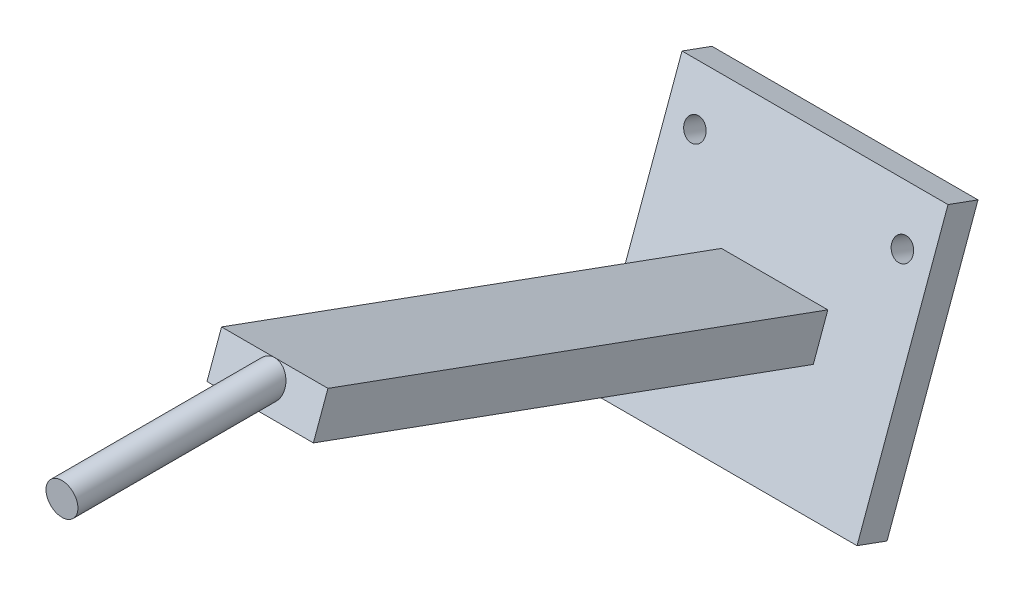
ISO-10303-21;
HEADER;
FILE_DESCRIPTION(('STEP AP214'),'2;1');
FILE_NAME('part.step','',(''),(''),'','','');
FILE_SCHEMA(('AUTOMOTIVE_DESIGN { 1 0 10303 214 1 1 1 1 }'));
ENDSEC;
DATA;
#1=APPLICATION_CONTEXT('core data for automotive mechanical design processes');
#2=APPLICATION_PROTOCOL_DEFINITION('international standard','automotive_design',2000,#1);
#3=PRODUCT_CONTEXT('',#1,'mechanical');
#4=PRODUCT('Part','Part','',(#3));
#5=PRODUCT_RELATED_PRODUCT_CATEGORY('part','',(#4));
#6=PRODUCT_DEFINITION_FORMATION('','',#4);
#7=PRODUCT_DEFINITION_CONTEXT('part definition',#1,'design');
#8=PRODUCT_DEFINITION('design','',#6,#7);
#9=PRODUCT_DEFINITION_SHAPE('','',#8);
#10=(LENGTH_UNIT() NAMED_UNIT(*) SI_UNIT(.MILLI.,.METRE.));
#11=(NAMED_UNIT(*) PLANE_ANGLE_UNIT() SI_UNIT($,.RADIAN.));
#12=(NAMED_UNIT(*) SI_UNIT($,.STERADIAN.) SOLID_ANGLE_UNIT());
#13=UNCERTAINTY_MEASURE_WITH_UNIT(LENGTH_MEASURE(1.E-05),#10,'distance_accuracy_value','');
#14=(GEOMETRIC_REPRESENTATION_CONTEXT(3) GLOBAL_UNCERTAINTY_ASSIGNED_CONTEXT((#13)) GLOBAL_UNIT_ASSIGNED_CONTEXT((#10,
#11,#12)) REPRESENTATION_CONTEXT('',''));
#15=CARTESIAN_POINT('',(0.,0.,0.));
#16=DIRECTION('',(0.,0.,1.));
#17=DIRECTION('',(1.,0.,0.));
#18=AXIS2_PLACEMENT_3D('',#15,#16,#17);
#19=CARTESIAN_POINT('',(-5.,1.5,0.));
#20=DIRECTION('',(0.,0.342020143325663,0.93969262078591));
#21=DIRECTION('',(0.,-0.939692620785911,0.342020143325663));
#22=AXIS2_PLACEMENT_3D('',#19,#20,#21);
#23=PLANE('',#22);
#24=DIRECTION('',(1.,0.,0.));
#25=VECTOR('',#24,1.);
#26=CARTESIAN_POINT('',(-5.,1.5,0.));
#27=LINE('',#26,#25);
#28=CARTESIAN_POINT('',(0.,1.5,0.));
#29=VERTEX_POINT('',#28);
#30=CARTESIAN_POINT('',(5.,1.5,0.));
#31=VERTEX_POINT('',#30);
#32=EDGE_CURVE('E172',#29,#31,#27,.T.);
#33=ORIENTED_EDGE('',*,*,#32,.F.);
#34=CARTESIAN_POINT('',(0.,0.,0.545955351399292));
#35=DIRECTION('',(0.,0.342020143325663,0.93969262078591));
#36=DIRECTION('',(0.,0.939692620785911,-0.342020143325663));
#37=AXIS2_PLACEMENT_3D('',#34,#35,#36);
#38=ELLIPSE('',#37,1.59626665871386,1.5);
#39=EDGE_CURVE('E48',#29,#29,#38,.T.);
#40=ORIENTED_EDGE('',*,*,#39,.F.);
#41=CARTESIAN_POINT('',(-5.,1.5,0.));
#42=VERTEX_POINT('',#41);
#43=EDGE_CURVE('E55',#42,#29,#27,.T.);
#44=ORIENTED_EDGE('',*,*,#43,.F.);
#45=DIRECTION('',(0.,-0.939692620785911,0.342020143325663));
#46=VECTOR('',#45,1.);
#47=CARTESIAN_POINT('',(-5.,1.5,0.));
#48=LINE('',#47,#46);
#49=CARTESIAN_POINT('',(-5.,-2.25877048314364,1.36808057330265));
#50=VERTEX_POINT('',#49);
#51=EDGE_CURVE('E162',#42,#50,#48,.T.);
#52=ORIENTED_EDGE('',*,*,#51,.T.);
#53=DIRECTION('',(1.,0.,0.));
#54=VECTOR('',#53,1.);
#55=CARTESIAN_POINT('',(-5.,-2.25877048314364,1.36808057330265));
#56=LINE('',#55,#54);
#57=CARTESIAN_POINT('',(5.,-2.25877048314364,1.36808057330265));
#58=VERTEX_POINT('',#57);
#59=EDGE_CURVE('E63',#50,#58,#56,.T.);
#60=ORIENTED_EDGE('',*,*,#59,.T.);
#61=DIRECTION('',(0.,-0.939692620785911,0.342020143325663));
#62=VECTOR('',#61,1.);
#63=CARTESIAN_POINT('',(5.,1.5,0.));
#64=LINE('',#63,#62);
#65=EDGE_CURVE('E142',#31,#58,#64,.T.);
#66=ORIENTED_EDGE('',*,*,#65,.F.);
#67=EDGE_LOOP('',(#33,#40,#44,#52,#60,#66));
#68=FACE_BOUND('',#67,.T.);
#69=ADVANCED_FACE('F39',(#68),#23,.T.);
#70=CARTESIAN_POINT('',(-5.,-15.6010071662831,-46.9846310392955));
#71=DIRECTION('',(0.,0.93969262078591,-0.342020143325663));
#72=DIRECTION('',(0.,0.342020143325663,0.939692620785911));
#73=AXIS2_PLACEMENT_3D('',#70,#71,#72);
#74=PLANE('',#73);
#75=ORIENTED_EDGE('',*,*,#43,.T.);
#76=ORIENTED_EDGE('',*,*,#32,.T.);
#77=DIRECTION('',(0.,0.342020143325663,0.939692620785911));
#78=VECTOR('',#77,1.);
#79=CARTESIAN_POINT('',(5.,-15.6010071662831,-46.9846310392955));
#80=LINE('',#79,#78);
#81=CARTESIAN_POINT('',(5.,-15.6010071662831,-46.9846310392955));
#82=VERTEX_POINT('',#81);
#83=EDGE_CURVE('E137',#82,#31,#80,.T.);
#84=ORIENTED_EDGE('',*,*,#83,.F.);
#85=DIRECTION('',(1.,0.,0.));
#86=VECTOR('',#85,1.);
#87=CARTESIAN_POINT('',(-5.,-15.6010071662831,-46.9846310392955));
#88=LINE('',#87,#86);
#89=CARTESIAN_POINT('',(-5.,-15.6010071662831,-46.9846310392955));
#90=VERTEX_POINT('',#89);
#91=EDGE_CURVE('E173',#90,#82,#88,.T.);
#92=ORIENTED_EDGE('',*,*,#91,.F.);
#93=DIRECTION('',(0.,0.342020143325663,0.939692620785911));
#94=VECTOR('',#93,1.);
#95=CARTESIAN_POINT('',(-5.,-15.6010071662831,-46.9846310392955));
#96=LINE('',#95,#94);
#97=EDGE_CURVE('E159',#90,#42,#96,.T.);
#98=ORIENTED_EDGE('',*,*,#97,.T.);
#99=EDGE_LOOP('',(#75,#76,#84,#92,#98));
#100=FACE_BOUND('',#99,.T.);
#101=ADVANCED_FACE('F193',(#100),#74,.T.);
#102=CARTESIAN_POINT('',(-5.,-2.25877048314364,1.36808057330265));
#103=DIRECTION('',(0.,-0.939692620785911,0.342020143325663));
#104=DIRECTION('',(0.,-0.342020143325663,-0.939692620785911));
#105=AXIS2_PLACEMENT_3D('',#102,#103,#104);
#106=PLANE('',#105);
#107=DIRECTION('',(1.,0.,0.));
#108=VECTOR('',#107,1.);
#109=CARTESIAN_POINT('',(-5.,-19.3597776494268,-45.6165504659929));
#110=LINE('',#109,#108);
#111=CARTESIAN_POINT('',(-5.,-19.3597776494268,-45.6165504659929));
#112=VERTEX_POINT('',#111);
#113=CARTESIAN_POINT('',(5.,-19.3597776494268,-45.6165504659929));
#114=VERTEX_POINT('',#113);
#115=EDGE_CURVE('E176',#112,#114,#110,.T.);
#116=ORIENTED_EDGE('',*,*,#115,.T.);
#117=DIRECTION('',(0.,-0.342020143325663,-0.939692620785911));
#118=VECTOR('',#117,1.);
#119=CARTESIAN_POINT('',(5.,-2.25877048314364,1.36808057330265));
#120=LINE('',#119,#118);
#121=EDGE_CURVE('E151',#58,#114,#120,.T.);
#122=ORIENTED_EDGE('',*,*,#121,.F.);
#123=ORIENTED_EDGE('',*,*,#59,.F.);
#124=DIRECTION('',(0.,-0.342020143325663,-0.939692620785911));
#125=VECTOR('',#124,1.);
#126=CARTESIAN_POINT('',(-5.,-2.25877048314364,1.36808057330265));
#127=LINE('',#126,#125);
#128=EDGE_CURVE('E166',#50,#112,#127,.T.);
#129=ORIENTED_EDGE('',*,*,#128,.T.);
#130=EDGE_LOOP('',(#116,#122,#123,#129));
#131=FACE_BOUND('',#130,.T.);
#132=ADVANCED_FACE('F200',(#131),#106,.T.);
#133=CARTESIAN_POINT('',(-5.,0.,0.));
#134=DIRECTION('',(1.,0.,0.));
#135=DIRECTION('',(0.,0.,-1.));
#136=AXIS2_PLACEMENT_3D('',#133,#134,#135);
#137=PLANE('',#136);
#138=ORIENTED_EDGE('',*,*,#97,.F.);
#139=DIRECTION('',(0.,0.939692620785911,-0.342020143325663));
#140=VECTOR('',#139,1.);
#141=CARTESIAN_POINT('',(-5.,-19.3597776494268,-45.6165504659929));
#142=LINE('',#141,#140);
#143=EDGE_CURVE('E169',#112,#90,#142,.T.);
#144=ORIENTED_EDGE('',*,*,#143,.F.);
#145=ORIENTED_EDGE('',*,*,#128,.F.);
#146=ORIENTED_EDGE('',*,*,#51,.F.);
#147=EDGE_LOOP('',(#138,#144,#145,#146));
#148=FACE_BOUND('',#147,.T.);
#149=ADVANCED_FACE('F203',(#148),#137,.F.);
#150=CARTESIAN_POINT('',(5.,0.,0.));
#151=DIRECTION('',(1.,0.,0.));
#152=DIRECTION('',(0.,0.,-1.));
#153=AXIS2_PLACEMENT_3D('',#150,#151,#152);
#154=PLANE('',#153);
#155=ORIENTED_EDGE('',*,*,#83,.T.);
#156=ORIENTED_EDGE('',*,*,#65,.T.);
#157=ORIENTED_EDGE('',*,*,#121,.T.);
#158=DIRECTION('',(0.,0.939692620785911,-0.342020143325663));
#159=VECTOR('',#158,1.);
#160=CARTESIAN_POINT('',(5.,-19.3597776494268,-45.6165504659929));
#161=LINE('',#160,#159);
#162=EDGE_CURVE('E155',#114,#82,#161,.T.);
#163=ORIENTED_EDGE('',*,*,#162,.T.);
#164=EDGE_LOOP('',(#155,#156,#157,#163));
#165=FACE_BOUND('',#164,.T.);
#166=ADVANCED_FACE('F197',(#165),#154,.T.);
#167=CARTESIAN_POINT('',(0.,0.,20.));
#168=DIRECTION('',(0.,0.,-1.));
#169=DIRECTION('',(-1.,0.,0.));
#170=AXIS2_PLACEMENT_3D('',#167,#168,#169);
#171=CYLINDRICAL_SURFACE('',#170,1.5);
#172=ORIENTED_EDGE('',*,*,#39,.T.);
#173=EDGE_LOOP('',(#172));
#174=FACE_BOUND('',#173,.T.);
#175=CARTESIAN_POINT('',(0.,0.,20.));
#176=DIRECTION('',(0.,0.,1.));
#177=DIRECTION('',(1.,0.,0.));
#178=AXIS2_PLACEMENT_3D('',#175,#176,#177);
#179=CIRCLE('',#178,1.5);
#180=CARTESIAN_POINT('',(1.5,0.,20.));
#181=VERTEX_POINT('',#180);
#182=EDGE_CURVE('E11',#181,#181,#179,.T.);
#183=ORIENTED_EDGE('',*,*,#182,.F.);
#184=EDGE_LOOP('',(#183));
#185=FACE_BOUND('',#184,.T.);
#186=ADVANCED_FACE('F41',(#174,#185),#171,.T.);
#187=CARTESIAN_POINT('',(0.,0.,20.));
#188=DIRECTION('',(0.,0.,1.));
#189=DIRECTION('',(1.,0.,0.));
#190=AXIS2_PLACEMENT_3D('',#187,#188,#189);
#191=PLANE('',#190);
#192=ORIENTED_EDGE('',*,*,#182,.T.);
#193=EDGE_LOOP('',(#192));
#194=FACE_BOUND('',#193,.T.);
#195=ADVANCED_FACE('F218',(#194),#191,.T.);
#196=CARTESIAN_POINT('',(0.,-16.9255404986224,-46.5025403320306));
#197=DIRECTION('',(0.,-0.342020143325663,-0.93969262078591));
#198=DIRECTION('',(0.,0.93969262078591,-0.342020143325663));
#199=AXIS2_PLACEMENT_3D('',#196,#197,#198);
#200=PLANE('',#199);
#201=CARTESIAN_POINT('',(9.75,-9.40799953233512,-49.2387014786359));
#202=DIRECTION('',(0.,-0.342020143325663,-0.93969262078591));
#203=DIRECTION('',(0.,0.93969262078591,-0.342020143325663));
#204=AXIS2_PLACEMENT_3D('',#201,#202,#203);
#205=CIRCLE('',#204,1.);
#206=CARTESIAN_POINT('',(9.75,-8.46830691154921,-49.5807216219616));
#207=VERTEX_POINT('',#206);
#208=EDGE_CURVE('E319',#207,#207,#205,.T.);
#209=ORIENTED_EDGE('',*,*,#208,.T.);
#210=EDGE_LOOP('',(#209));
#211=FACE_BOUND('',#210,.T.);
#212=CARTESIAN_POINT('',(-9.75,-9.40799953233512,-49.2387014786359));
#213=DIRECTION('',(0.,-0.342020143325663,-0.93969262078591));
#214=DIRECTION('',(0.,0.93969262078591,-0.342020143325663));
#215=AXIS2_PLACEMENT_3D('',#212,#213,#214);
#216=CIRCLE('',#215,1.);
#217=CARTESIAN_POINT('',(-9.75,-8.46830691154921,-49.5807216219616));
#218=VERTEX_POINT('',#217);
#219=EDGE_CURVE('E321',#218,#218,#216,.T.);
#220=ORIENTED_EDGE('',*,*,#219,.T.);
#221=EDGE_LOOP('',(#220));
#222=FACE_BOUND('',#221,.T.);
#223=DIRECTION('',(0.,0.93969262078591,-0.342020143325663));
#224=VECTOR('',#223,1.);
#225=CARTESIAN_POINT('',(-12.5,-5.17938273879851,-50.7777921236014));
#226=LINE('',#225,#224);
#227=CARTESIAN_POINT('',(-12.5,-28.6716982584463,-42.2272885404598));
#228=VERTEX_POINT('',#227);
#229=CARTESIAN_POINT('',(-12.5,-5.17938273879851,-50.7777921236014));
#230=VERTEX_POINT('',#229);
#231=EDGE_CURVE('E135',#228,#230,#226,.T.);
#232=ORIENTED_EDGE('',*,*,#231,.F.);
#233=DIRECTION('',(-1.,0.,0.));
#234=VECTOR('',#233,1.);
#235=CARTESIAN_POINT('',(12.5,-28.6716982584463,-42.2272885404598));
#236=LINE('',#235,#234);
#237=CARTESIAN_POINT('',(12.5,-28.6716982584463,-42.2272885404598));
#238=VERTEX_POINT('',#237);
#239=EDGE_CURVE('E131',#238,#228,#236,.T.);
#240=ORIENTED_EDGE('',*,*,#239,.F.);
#241=DIRECTION('',(0.,-0.93969262078591,0.342020143325663));
#242=VECTOR('',#241,1.);
#243=CARTESIAN_POINT('',(12.5,-5.17938273879851,-50.7777921236014));
#244=LINE('',#243,#242);
#245=CARTESIAN_POINT('',(12.5,-5.17938273879851,-50.7777921236014));
#246=VERTEX_POINT('',#245);
#247=EDGE_CURVE('E338',#246,#238,#244,.T.);
#248=ORIENTED_EDGE('',*,*,#247,.F.);
#249=DIRECTION('',(1.,0.,0.));
#250=VECTOR('',#249,1.);
#251=CARTESIAN_POINT('',(12.5,-5.17938273879851,-50.7777921236014));
#252=LINE('',#251,#250);
#253=EDGE_CURVE('E325',#230,#246,#252,.T.);
#254=ORIENTED_EDGE('',*,*,#253,.F.);
#255=EDGE_LOOP('',(#232,#240,#248,#254));
#256=FACE_BOUND('',#255,.T.);
#257=ORIENTED_EDGE('',*,*,#115,.F.);
#258=ORIENTED_EDGE('',*,*,#143,.T.);
#259=ORIENTED_EDGE('',*,*,#91,.T.);
#260=ORIENTED_EDGE('',*,*,#162,.F.);
#261=EDGE_LOOP('',(#257,#258,#259,#260));
#262=FACE_BOUND('',#261,.T.);
#263=ADVANCED_FACE('F199',(#211,#222,#256,#262),#200,.F.);
#264=CARTESIAN_POINT('',(-12.5,-6.20544316877549,-53.5968699859592));
#265=DIRECTION('',(1.,0.,0.));
#266=DIRECTION('',(0.,1.,0.));
#267=AXIS2_PLACEMENT_3D('',#264,#265,#266);
#268=PLANE('',#267);
#269=ORIENTED_EDGE('',*,*,#231,.T.);
#270=DIRECTION('',(0.,0.342020143325663,0.93969262078591));
#271=VECTOR('',#270,1.);
#272=CARTESIAN_POINT('',(-12.5,-6.20544316877549,-53.5968699859592));
#273=LINE('',#272,#271);
#274=CARTESIAN_POINT('',(-12.5,-6.20544316877549,-53.5968699859592));
#275=VERTEX_POINT('',#274);
#276=EDGE_CURVE('E113',#275,#230,#273,.T.);
#277=ORIENTED_EDGE('',*,*,#276,.F.);
#278=DIRECTION('',(0.,0.93969262078591,-0.342020143325663));
#279=VECTOR('',#278,1.);
#280=CARTESIAN_POINT('',(-12.5,-6.20544316877549,-53.5968699859592));
#281=LINE('',#280,#279);
#282=CARTESIAN_POINT('',(-12.5,-29.6977586884233,-45.0463664028176));
#283=VERTEX_POINT('',#282);
#284=EDGE_CURVE('E121',#283,#275,#281,.T.);
#285=ORIENTED_EDGE('',*,*,#284,.F.);
#286=DIRECTION('',(0.,0.342020143325663,0.93969262078591));
#287=VECTOR('',#286,1.);
#288=CARTESIAN_POINT('',(-12.5,-29.6977586884233,-45.0463664028176));
#289=LINE('',#288,#287);
#290=EDGE_CURVE('E334',#283,#228,#289,.T.);
#291=ORIENTED_EDGE('',*,*,#290,.T.);
#292=EDGE_LOOP('',(#269,#277,#285,#291));
#293=FACE_BOUND('',#292,.T.);
#294=ADVANCED_FACE('F133',(#293),#268,.F.);
#295=CARTESIAN_POINT('',(12.5,-6.20544316877549,-53.5968699859592));
#296=DIRECTION('',(0.,-0.93969262078591,0.342020143325663));
#297=DIRECTION('',(0.,-0.342020143325663,-0.939692620785911));
#298=AXIS2_PLACEMENT_3D('',#295,#296,#297);
#299=PLANE('',#298);
#300=ORIENTED_EDGE('',*,*,#253,.T.);
#301=DIRECTION('',(0.,0.342020143325663,0.93969262078591));
#302=VECTOR('',#301,1.);
#303=CARTESIAN_POINT('',(12.5,-6.20544316877549,-53.5968699859592));
#304=LINE('',#303,#302);
#305=CARTESIAN_POINT('',(12.5,-6.20544316877549,-53.5968699859592));
#306=VERTEX_POINT('',#305);
#307=EDGE_CURVE('E116',#306,#246,#304,.T.);
#308=ORIENTED_EDGE('',*,*,#307,.F.);
#309=DIRECTION('',(1.,0.,0.));
#310=VECTOR('',#309,1.);
#311=CARTESIAN_POINT('',(12.5,-6.20544316877549,-53.5968699859592));
#312=LINE('',#311,#310);
#313=EDGE_CURVE('E109',#275,#306,#312,.T.);
#314=ORIENTED_EDGE('',*,*,#313,.F.);
#315=ORIENTED_EDGE('',*,*,#276,.T.);
#316=EDGE_LOOP('',(#300,#308,#314,#315));
#317=FACE_BOUND('',#316,.T.);
#318=ADVANCED_FACE('F111',(#317),#299,.F.);
#319=CARTESIAN_POINT('',(12.5,-6.20544316877549,-53.5968699859592));
#320=DIRECTION('',(-1.,0.,0.));
#321=DIRECTION('',(0.,-1.,0.));
#322=AXIS2_PLACEMENT_3D('',#319,#320,#321);
#323=PLANE('',#322);
#324=ORIENTED_EDGE('',*,*,#247,.T.);
#325=DIRECTION('',(0.,0.342020143325663,0.93969262078591));
#326=VECTOR('',#325,1.);
#327=CARTESIAN_POINT('',(12.5,-29.6977586884233,-45.0463664028176));
#328=LINE('',#327,#326);
#329=CARTESIAN_POINT('',(12.5,-29.6977586884233,-45.0463664028176));
#330=VERTEX_POINT('',#329);
#331=EDGE_CURVE('E144',#330,#238,#328,.T.);
#332=ORIENTED_EDGE('',*,*,#331,.F.);
#333=DIRECTION('',(0.,-0.93969262078591,0.342020143325663));
#334=VECTOR('',#333,1.);
#335=CARTESIAN_POINT('',(12.5,-6.20544316877549,-53.5968699859592));
#336=LINE('',#335,#334);
#337=EDGE_CURVE('E120',#306,#330,#336,.T.);
#338=ORIENTED_EDGE('',*,*,#337,.F.);
#339=ORIENTED_EDGE('',*,*,#307,.T.);
#340=EDGE_LOOP('',(#324,#332,#338,#339));
#341=FACE_BOUND('',#340,.T.);
#342=ADVANCED_FACE('F256',(#341),#323,.F.);
#343=CARTESIAN_POINT('',(12.5,-29.6977586884233,-45.0463664028176));
#344=DIRECTION('',(0.,0.93969262078591,-0.342020143325663));
#345=DIRECTION('',(0.,0.342020143325663,0.939692620785911));
#346=AXIS2_PLACEMENT_3D('',#343,#344,#345);
#347=PLANE('',#346);
#348=ORIENTED_EDGE('',*,*,#239,.T.);
#349=ORIENTED_EDGE('',*,*,#290,.F.);
#350=DIRECTION('',(-1.,0.,0.));
#351=VECTOR('',#350,1.);
#352=CARTESIAN_POINT('',(12.5,-29.6977586884233,-45.0463664028176));
#353=LINE('',#352,#351);
#354=EDGE_CURVE('E126',#330,#283,#353,.T.);
#355=ORIENTED_EDGE('',*,*,#354,.F.);
#356=ORIENTED_EDGE('',*,*,#331,.T.);
#357=EDGE_LOOP('',(#348,#349,#355,#356));
#358=FACE_BOUND('',#357,.T.);
#359=ADVANCED_FACE('F265',(#358),#347,.F.);
#360=CARTESIAN_POINT('',(0.,-17.9516009285994,-49.3216181943884));
#361=DIRECTION('',(0.,-0.342020143325663,-0.93969262078591));
#362=DIRECTION('',(0.,0.93969262078591,-0.342020143325663));
#363=AXIS2_PLACEMENT_3D('',#360,#361,#362);
#364=PLANE('',#363);
#365=CARTESIAN_POINT('',(9.75,-10.4340599623121,-52.0577793409937));
#366=DIRECTION('',(0.,-0.342020143325663,-0.93969262078591));
#367=DIRECTION('',(0.,0.93969262078591,-0.342020143325663));
#368=AXIS2_PLACEMENT_3D('',#365,#366,#367);
#369=CIRCLE('',#368,1.);
#370=CARTESIAN_POINT('',(9.75,-9.49436734152619,-52.3997994843193));
#371=VERTEX_POINT('',#370);
#372=EDGE_CURVE('E316',#371,#371,#369,.T.);
#373=ORIENTED_EDGE('',*,*,#372,.F.);
#374=EDGE_LOOP('',(#373));
#375=FACE_BOUND('',#374,.T.);
#376=CARTESIAN_POINT('',(-9.75,-10.4340599623121,-52.0577793409937));
#377=DIRECTION('',(0.,-0.342020143325663,-0.93969262078591));
#378=DIRECTION('',(0.,0.93969262078591,-0.342020143325663));
#379=AXIS2_PLACEMENT_3D('',#376,#377,#378);
#380=CIRCLE('',#379,1.);
#381=CARTESIAN_POINT('',(-9.75,-9.49436734152619,-52.3997994843193));
#382=VERTEX_POINT('',#381);
#383=EDGE_CURVE('E350',#382,#382,#380,.T.);
#384=ORIENTED_EDGE('',*,*,#383,.F.);
#385=EDGE_LOOP('',(#384));
#386=FACE_BOUND('',#385,.T.);
#387=ORIENTED_EDGE('',*,*,#284,.T.);
#388=ORIENTED_EDGE('',*,*,#313,.T.);
#389=ORIENTED_EDGE('',*,*,#337,.T.);
#390=ORIENTED_EDGE('',*,*,#354,.T.);
#391=EDGE_LOOP('',(#387,#388,#389,#390));
#392=FACE_BOUND('',#391,.T.);
#393=ADVANCED_FACE('F124',(#375,#386,#392),#364,.T.);
#394=CARTESIAN_POINT('',(-9.75,14.1208837308133,15.4063739918495));
#395=DIRECTION('',(0.,-0.342020143325663,-0.93969262078591));
#396=DIRECTION('',(0.,0.939692620785911,-0.342020143325663));
#397=AXIS2_PLACEMENT_3D('',#394,#395,#396);
#398=CYLINDRICAL_SURFACE('',#397,1.);
#399=CARTESIAN_POINT('',(-9.75,-9.49436734152619,-52.3997994843193));
#400=CARTESIAN_POINT('',(-9.75,-9.48367921204727,-52.3704340899198));
#401=CARTESIAN_POINT('',(-9.75,-9.47299108256834,-52.3410686955202));
#402=CARTESIAN_POINT('',(-9.75,-9.45161482361049,-52.2823379067211));
#403=CARTESIAN_POINT('',(-9.75,-9.44092669413156,-52.2529725123215));
#404=CARTESIAN_POINT('',(-9.75,-9.41955043517371,-52.1942417235224));
#405=CARTESIAN_POINT('',(-9.75,-9.40886230569478,-52.1648763291229));
#406=CARTESIAN_POINT('',(-9.75,-9.38748604673693,-52.1061455403237));
#407=CARTESIAN_POINT('',(-9.75,-9.376797917258,-52.0767801459242));
#408=CARTESIAN_POINT('',(-9.75,-9.35542165830014,-52.0180493571251));
#409=CARTESIAN_POINT('',(-9.75,-9.34473352882122,-51.9886839627255));
#410=CARTESIAN_POINT('',(-9.75,-9.32335726986336,-51.9299531739264));
#411=CARTESIAN_POINT('',(-9.75,-9.31266914038444,-51.9005877795268));
#412=CARTESIAN_POINT('',(-9.75,-9.29129288142658,-51.8418569907277));
#413=CARTESIAN_POINT('',(-9.75,-9.28060475194766,-51.8124915963281));
#414=CARTESIAN_POINT('',(-9.75,-9.2592284929898,-51.753760807529));
#415=CARTESIAN_POINT('',(-9.75,-9.24854036351087,-51.7243954131295));
#416=CARTESIAN_POINT('',(-9.75,-9.22716410455302,-51.6656646243303));
#417=CARTESIAN_POINT('',(-9.75,-9.2164759750741,-51.6362992299308));
#418=CARTESIAN_POINT('',(-9.75,-9.19509971611624,-51.5775684411317));
#419=CARTESIAN_POINT('',(-9.75,-9.18441158663731,-51.5482030467321));
#420=CARTESIAN_POINT('',(-9.75,-9.16303532767946,-51.489472257933));
#421=CARTESIAN_POINT('',(-9.75,-9.15234719820053,-51.4601068635334));
#422=CARTESIAN_POINT('',(-9.75,-9.13097093924268,-51.4013760747343));
#423=CARTESIAN_POINT('',(-9.75,-9.12028280976375,-51.3720106803347));
#424=CARTESIAN_POINT('',(-9.75,-9.0989065508059,-51.3132798915356));
#425=CARTESIAN_POINT('',(-9.75,-9.08821842132697,-51.2839144971361));
#426=CARTESIAN_POINT('',(-9.75,-9.06684216236912,-51.2251837083369));
#427=CARTESIAN_POINT('',(-9.75,-9.05615403289019,-51.1958183139374));
#428=CARTESIAN_POINT('',(-9.75,-9.03477777393234,-51.1370875251383));
#429=CARTESIAN_POINT('',(-9.75,-9.02408964445341,-51.1077221307387));
#430=CARTESIAN_POINT('',(-9.75,-9.00271338549556,-51.0489913419396));
#431=CARTESIAN_POINT('',(-9.75,-8.99202525601663,-51.01962594754));
#432=CARTESIAN_POINT('',(-9.75,-8.97064899705878,-50.9608951587409));
#433=CARTESIAN_POINT('',(-9.75,-8.95996086757985,-50.9315297643413));
#434=CARTESIAN_POINT('',(-9.75,-8.938584608622,-50.8727989755422));
#435=CARTESIAN_POINT('',(-9.75,-8.92789647914307,-50.8434335811427));
#436=CARTESIAN_POINT('',(-9.75,-8.90652022018522,-50.7847027923436));
#437=CARTESIAN_POINT('',(-9.75,-8.89583209070629,-50.755337397944));
#438=CARTESIAN_POINT('',(-9.75,-8.87445583174843,-50.6966066091449));
#439=CARTESIAN_POINT('',(-9.75,-8.86376770226951,-50.6672412147453));
#440=CARTESIAN_POINT('',(-9.75,-8.84239144331165,-50.6085104259462));
#441=CARTESIAN_POINT('',(-9.75,-8.83170331383272,-50.5791450315466));
#442=CARTESIAN_POINT('',(-9.75,-8.81032705487487,-50.5204142427475));
#443=CARTESIAN_POINT('',(-9.75,-8.79963892539595,-50.491048848348));
#444=CARTESIAN_POINT('',(-9.75,-8.77826266643809,-50.4323180595488));
#445=CARTESIAN_POINT('',(-9.75,-8.76757453695917,-50.4029526651493));
#446=CARTESIAN_POINT('',(-9.75,-8.74619827800131,-50.3442218763502));
#447=CARTESIAN_POINT('',(-9.75,-8.73551014852239,-50.3148564819506));
#448=CARTESIAN_POINT('',(-9.75,-8.71413388956453,-50.2561256931515));
#449=CARTESIAN_POINT('',(-9.75,-8.70344576008561,-50.2267602987519));
#450=CARTESIAN_POINT('',(-9.75,-8.68206950112775,-50.1680295099528));
#451=CARTESIAN_POINT('',(-9.75,-8.67138137164882,-50.1386641155532));
#452=CARTESIAN_POINT('',(-9.75,-8.65000511269097,-50.0799333267541));
#453=CARTESIAN_POINT('',(-9.75,-8.63931698321204,-50.0505679323546));
#454=CARTESIAN_POINT('',(-9.75,-8.61794072425419,-49.9918371435555));
#455=CARTESIAN_POINT('',(-9.75,-8.60725259477526,-49.9624717491559));
#456=CARTESIAN_POINT('',(-9.75,-8.58587633581741,-49.9037409603568));
#457=CARTESIAN_POINT('',(-9.75,-8.57518820633848,-49.8743755659572));
#458=CARTESIAN_POINT('',(-9.75,-8.55381194738063,-49.8156447771581));
#459=CARTESIAN_POINT('',(-9.75,-8.5431238179017,-49.7862793827585));
#460=CARTESIAN_POINT('',(-9.75,-8.52174755894385,-49.7275485939594));
#461=CARTESIAN_POINT('',(-9.75,-8.51105942946492,-49.6981831995599));
#462=CARTESIAN_POINT('',(-9.75,-8.48968317050706,-49.6394524107607));
#463=CARTESIAN_POINT('',(-9.75,-8.47899504102814,-49.6100870163612));
#464=CARTESIAN_POINT('',(-9.75,-8.46830691154921,-49.5807216219616));
#465=B_SPLINE_CURVE_WITH_KNOTS('',3,(#399,#400,#401,#402,#403,#404,#405,#406,#407,#408,#409,
#410,#411,#412,#413,#414,#415,#416,#417,#418,#419,#420,#421,#422,#423,#424,#425,#426,#427,#428,
#429,#430,#431,#432,#433,#434,#435,#436,#437,#438,#439,#440,#441,#442,#443,#444,#445,#446,#447,
#448,#449,#450,#451,#452,#453,#454,#455,#456,#457,#458,#459,#460,#461,#462,#463,#464),
.UNSPECIFIED.,.F.,.F.,(4,2,2,2,2,2,2,2,2,2,2,2,2,2,2,2,2,2,2,2,2,2,2,2,2,2,2,2,2,2,2,2,4),(0.,
0.0937500000000086,0.187500000000003,0.281249999999998,0.375000000000008,0.468749999999989,
0.562499999999998,0.656250000000007,0.750000000000002,0.843749999999996,0.937499999999993,
1.03125,1.125,1.21874999999999,1.3125,1.40625,1.49999999999999,1.59375,1.68749999999998,
1.78124999999999,1.875,1.96874999999998,2.06249999999999,2.15624999999999,2.24999999999998,
2.34374999999999,2.43749999999998,2.53124999999999,2.62499999999998,2.71874999999998,
2.81249999999999,2.90624999999997,2.99999999999998),.UNSPECIFIED.);
#466=EDGE_CURVE('BSEAM289',#382,#218,#465,.T.);
#467=ORIENTED_EDGE('',*,*,#383,.T.);
#468=ORIENTED_EDGE('',*,*,#219,.F.);
#469=ORIENTED_EDGE('',*,*,#466,.T.);
#470=ORIENTED_EDGE('',*,*,#466,.F.);
#471=EDGE_LOOP('',(#467,#469,#468,#470));
#472=FACE_BOUND('',#471,.T.);
#473=ADVANCED_FACE('F289',(#472),#398,.F.);
#474=CARTESIAN_POINT('',(9.75,14.1208837308133,15.4063739918495));
#475=DIRECTION('',(0.,-0.342020143325663,-0.93969262078591));
#476=DIRECTION('',(0.,0.939692620785911,-0.342020143325663));
#477=AXIS2_PLACEMENT_3D('',#474,#475,#476);
#478=CYLINDRICAL_SURFACE('',#477,1.);
#479=CARTESIAN_POINT('',(9.75,-9.49436734152619,-52.3997994843193));
#480=CARTESIAN_POINT('',(9.75,-9.48367921204727,-52.3704340899198));
#481=CARTESIAN_POINT('',(9.75,-9.47299108256834,-52.3410686955202));
#482=CARTESIAN_POINT('',(9.75,-9.45161482361049,-52.2823379067211));
#483=CARTESIAN_POINT('',(9.75,-9.44092669413156,-52.2529725123215));
#484=CARTESIAN_POINT('',(9.75,-9.41955043517371,-52.1942417235224));
#485=CARTESIAN_POINT('',(9.75,-9.40886230569478,-52.1648763291229));
#486=CARTESIAN_POINT('',(9.75,-9.38748604673693,-52.1061455403237));
#487=CARTESIAN_POINT('',(9.75,-9.376797917258,-52.0767801459242));
#488=CARTESIAN_POINT('',(9.75,-9.35542165830014,-52.0180493571251));
#489=CARTESIAN_POINT('',(9.75,-9.34473352882122,-51.9886839627255));
#490=CARTESIAN_POINT('',(9.75,-9.32335726986336,-51.9299531739264));
#491=CARTESIAN_POINT('',(9.75,-9.31266914038444,-51.9005877795268));
#492=CARTESIAN_POINT('',(9.75,-9.29129288142658,-51.8418569907277));
#493=CARTESIAN_POINT('',(9.75,-9.28060475194766,-51.8124915963281));
#494=CARTESIAN_POINT('',(9.75,-9.2592284929898,-51.753760807529));
#495=CARTESIAN_POINT('',(9.75,-9.24854036351087,-51.7243954131295));
#496=CARTESIAN_POINT('',(9.75,-9.22716410455302,-51.6656646243303));
#497=CARTESIAN_POINT('',(9.75,-9.2164759750741,-51.6362992299308));
#498=CARTESIAN_POINT('',(9.75,-9.19509971611624,-51.5775684411317));
#499=CARTESIAN_POINT('',(9.75,-9.18441158663731,-51.5482030467321));
#500=CARTESIAN_POINT('',(9.75,-9.16303532767946,-51.489472257933));
#501=CARTESIAN_POINT('',(9.75,-9.15234719820053,-51.4601068635334));
#502=CARTESIAN_POINT('',(9.75,-9.13097093924268,-51.4013760747343));
#503=CARTESIAN_POINT('',(9.75,-9.12028280976375,-51.3720106803347));
#504=CARTESIAN_POINT('',(9.75,-9.0989065508059,-51.3132798915356));
#505=CARTESIAN_POINT('',(9.75,-9.08821842132697,-51.2839144971361));
#506=CARTESIAN_POINT('',(9.75,-9.06684216236912,-51.2251837083369));
#507=CARTESIAN_POINT('',(9.75,-9.05615403289019,-51.1958183139374));
#508=CARTESIAN_POINT('',(9.75,-9.03477777393234,-51.1370875251383));
#509=CARTESIAN_POINT('',(9.75,-9.02408964445341,-51.1077221307387));
#510=CARTESIAN_POINT('',(9.75,-9.00271338549556,-51.0489913419396));
#511=CARTESIAN_POINT('',(9.75,-8.99202525601663,-51.01962594754));
#512=CARTESIAN_POINT('',(9.75,-8.97064899705878,-50.9608951587409));
#513=CARTESIAN_POINT('',(9.75,-8.95996086757985,-50.9315297643413));
#514=CARTESIAN_POINT('',(9.75,-8.938584608622,-50.8727989755422));
#515=CARTESIAN_POINT('',(9.75,-8.92789647914307,-50.8434335811427));
#516=CARTESIAN_POINT('',(9.75,-8.90652022018522,-50.7847027923436));
#517=CARTESIAN_POINT('',(9.75,-8.89583209070629,-50.755337397944));
#518=CARTESIAN_POINT('',(9.75,-8.87445583174843,-50.6966066091449));
#519=CARTESIAN_POINT('',(9.75,-8.86376770226951,-50.6672412147453));
#520=CARTESIAN_POINT('',(9.75,-8.84239144331165,-50.6085104259462));
#521=CARTESIAN_POINT('',(9.75,-8.83170331383272,-50.5791450315466));
#522=CARTESIAN_POINT('',(9.75,-8.81032705487487,-50.5204142427475));
#523=CARTESIAN_POINT('',(9.75,-8.79963892539595,-50.491048848348));
#524=CARTESIAN_POINT('',(9.75,-8.77826266643809,-50.4323180595488));
#525=CARTESIAN_POINT('',(9.75,-8.76757453695917,-50.4029526651493));
#526=CARTESIAN_POINT('',(9.75,-8.74619827800131,-50.3442218763502));
#527=CARTESIAN_POINT('',(9.75,-8.73551014852239,-50.3148564819506));
#528=CARTESIAN_POINT('',(9.75,-8.71413388956453,-50.2561256931515));
#529=CARTESIAN_POINT('',(9.75,-8.70344576008561,-50.2267602987519));
#530=CARTESIAN_POINT('',(9.75,-8.68206950112775,-50.1680295099528));
#531=CARTESIAN_POINT('',(9.75,-8.67138137164882,-50.1386641155532));
#532=CARTESIAN_POINT('',(9.75,-8.65000511269097,-50.0799333267541));
#533=CARTESIAN_POINT('',(9.75,-8.63931698321204,-50.0505679323546));
#534=CARTESIAN_POINT('',(9.75,-8.61794072425419,-49.9918371435555));
#535=CARTESIAN_POINT('',(9.75,-8.60725259477526,-49.9624717491559));
#536=CARTESIAN_POINT('',(9.75,-8.58587633581741,-49.9037409603568));
#537=CARTESIAN_POINT('',(9.75,-8.57518820633848,-49.8743755659572));
#538=CARTESIAN_POINT('',(9.75,-8.55381194738063,-49.8156447771581));
#539=CARTESIAN_POINT('',(9.75,-8.5431238179017,-49.7862793827585));
#540=CARTESIAN_POINT('',(9.75,-8.52174755894385,-49.7275485939594));
#541=CARTESIAN_POINT('',(9.75,-8.51105942946492,-49.6981831995599));
#542=CARTESIAN_POINT('',(9.75,-8.48968317050706,-49.6394524107607));
#543=CARTESIAN_POINT('',(9.75,-8.47899504102814,-49.6100870163612));
#544=CARTESIAN_POINT('',(9.75,-8.46830691154921,-49.5807216219616));
#545=B_SPLINE_CURVE_WITH_KNOTS('',3,(#479,#480,#481,#482,#483,#484,#485,#486,#487,#488,#489,
#490,#491,#492,#493,#494,#495,#496,#497,#498,#499,#500,#501,#502,#503,#504,#505,#506,#507,#508,
#509,#510,#511,#512,#513,#514,#515,#516,#517,#518,#519,#520,#521,#522,#523,#524,#525,#526,#527,
#528,#529,#530,#531,#532,#533,#534,#535,#536,#537,#538,#539,#540,#541,#542,#543,#544),
.UNSPECIFIED.,.F.,.F.,(4,2,2,2,2,2,2,2,2,2,2,2,2,2,2,2,2,2,2,2,2,2,2,2,2,2,2,2,2,2,2,2,4),(0.,
0.0937500000000086,0.187500000000003,0.281249999999998,0.375000000000008,0.468749999999989,
0.562499999999998,0.656250000000007,0.750000000000002,0.843749999999996,0.937499999999993,
1.03125,1.125,1.21874999999999,1.3125,1.40625,1.49999999999999,1.59375,1.68749999999998,
1.78124999999999,1.875,1.96874999999998,2.06249999999999,2.15624999999999,2.24999999999998,
2.34374999999999,2.43749999999998,2.53124999999999,2.62499999999998,2.71874999999998,
2.81249999999999,2.90624999999997,2.99999999999998),.UNSPECIFIED.);
#546=EDGE_CURVE('BSEAM299',#371,#207,#545,.T.);
#547=ORIENTED_EDGE('',*,*,#372,.T.);
#548=ORIENTED_EDGE('',*,*,#208,.F.);
#549=ORIENTED_EDGE('',*,*,#546,.T.);
#550=ORIENTED_EDGE('',*,*,#546,.F.);
#551=EDGE_LOOP('',(#547,#549,#548,#550));
#552=FACE_BOUND('',#551,.T.);
#553=ADVANCED_FACE('F299',(#552),#478,.F.);
#554=CLOSED_SHELL('',(#69,#101,#132,#149,#166,#186,#195,#263,#294,#318,#342,#359,#393,#473,#553));
#555=MANIFOLD_SOLID_BREP('B2',#554);
#556=ADVANCED_BREP_SHAPE_REPRESENTATION('',(#18,#555),#14);
#557=SHAPE_DEFINITION_REPRESENTATION(#9,#556);
ENDSEC;
END-ISO-10303-21;
